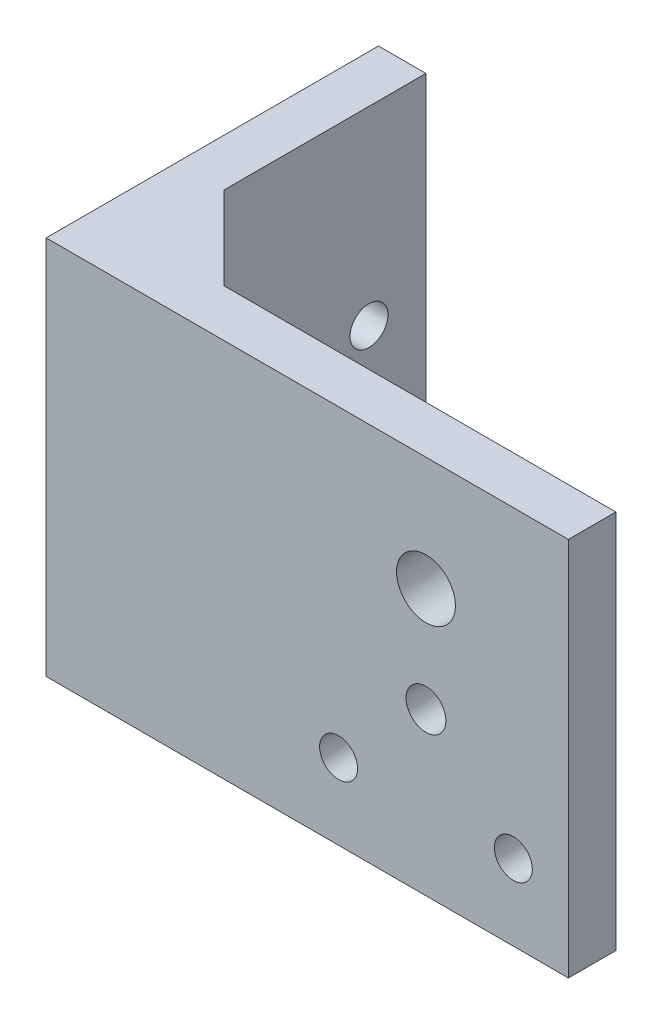
ISO-10303-21;
HEADER;
FILE_DESCRIPTION(('STEP AP214'),'2;1');
FILE_NAME('part.step','',(''),(''),'','','');
FILE_SCHEMA(('AUTOMOTIVE_DESIGN { 1 0 10303 214 1 1 1 1 }'));
ENDSEC;
DATA;
#1=APPLICATION_CONTEXT('core data for automotive mechanical design processes');
#2=APPLICATION_PROTOCOL_DEFINITION('international standard','automotive_design',2000,#1);
#3=PRODUCT_CONTEXT('',#1,'mechanical');
#4=PRODUCT('Part','Part','',(#3));
#5=PRODUCT_RELATED_PRODUCT_CATEGORY('part','',(#4));
#6=PRODUCT_DEFINITION_FORMATION('','',#4);
#7=PRODUCT_DEFINITION_CONTEXT('part definition',#1,'design');
#8=PRODUCT_DEFINITION('design','',#6,#7);
#9=PRODUCT_DEFINITION_SHAPE('','',#8);
#10=(LENGTH_UNIT() NAMED_UNIT(*) SI_UNIT(.MILLI.,.METRE.));
#11=(NAMED_UNIT(*) PLANE_ANGLE_UNIT() SI_UNIT($,.RADIAN.));
#12=(NAMED_UNIT(*) SI_UNIT($,.STERADIAN.) SOLID_ANGLE_UNIT());
#13=UNCERTAINTY_MEASURE_WITH_UNIT(LENGTH_MEASURE(1.E-05),#10,'distance_accuracy_value','');
#14=(GEOMETRIC_REPRESENTATION_CONTEXT(3) GLOBAL_UNCERTAINTY_ASSIGNED_CONTEXT((#13)) GLOBAL_UNIT_ASSIGNED_CONTEXT((#10,
#11,#12)) REPRESENTATION_CONTEXT('',''));
#15=CARTESIAN_POINT('',(0.,0.,0.));
#16=DIRECTION('',(0.,0.,1.));
#17=DIRECTION('',(1.,0.,0.));
#18=AXIS2_PLACEMENT_3D('',#15,#16,#17);
#19=CARTESIAN_POINT('',(5.,40.,-35.));
#20=DIRECTION('',(1.,0.,0.));
#21=DIRECTION('',(0.,0.,-1.));
#22=AXIS2_PLACEMENT_3D('',#19,#20,#21);
#23=PLANE('',#22);
#24=CARTESIAN_POINT('',(5.,31.,-11.));
#25=DIRECTION('',(1.,0.,0.));
#26=DIRECTION('',(0.,0.,-1.));
#27=AXIS2_PLACEMENT_3D('',#24,#25,#26);
#28=CIRCLE('',#27,2.);
#29=CARTESIAN_POINT('',(5.,31.,-13.));
#30=VERTEX_POINT('',#29);
#31=EDGE_CURVE('E481',#30,#30,#28,.T.);
#32=ORIENTED_EDGE('',*,*,#31,.F.);
#33=EDGE_LOOP('',(#32));
#34=FACE_BOUND('',#33,.T.);
#35=CARTESIAN_POINT('',(5.,20.,-29.));
#36=DIRECTION('',(1.,0.,0.));
#37=DIRECTION('',(0.,0.,-1.));
#38=AXIS2_PLACEMENT_3D('',#35,#36,#37);
#39=CIRCLE('',#38,2.);
#40=CARTESIAN_POINT('',(5.,20.,-31.));
#41=VERTEX_POINT('',#40);
#42=EDGE_CURVE('E477',#41,#41,#39,.T.);
#43=ORIENTED_EDGE('',*,*,#42,.F.);
#44=EDGE_LOOP('',(#43));
#45=FACE_BOUND('',#44,.T.);
#46=CARTESIAN_POINT('',(5.,8.99999999999999,-11.));
#47=DIRECTION('',(1.,0.,0.));
#48=DIRECTION('',(0.,0.,-1.));
#49=AXIS2_PLACEMENT_3D('',#46,#47,#48);
#50=CIRCLE('',#49,2.);
#51=CARTESIAN_POINT('',(5.,8.99999999999999,-13.));
#52=VERTEX_POINT('',#51);
#53=EDGE_CURVE('E469',#52,#52,#50,.T.);
#54=ORIENTED_EDGE('',*,*,#53,.F.);
#55=EDGE_LOOP('',(#54));
#56=FACE_BOUND('',#55,.T.);
#57=DIRECTION('',(0.,0.,1.));
#58=VECTOR('',#57,1.);
#59=CARTESIAN_POINT('',(5.,5.,-13.7500000000001));
#60=LINE('',#59,#58);
#61=CARTESIAN_POINT('',(5.,5.,-13.7500000000001));
#62=VERTEX_POINT('',#61);
#63=CARTESIAN_POINT('',(5.,5.,-5.));
#64=VERTEX_POINT('',#63);
#65=EDGE_CURVE('E195',#62,#64,#60,.T.);
#66=ORIENTED_EDGE('',*,*,#65,.F.);
#67=DIRECTION('',(0.,-1.,0.));
#68=VECTOR('',#67,1.);
#69=CARTESIAN_POINT('',(5.,5.,-13.7500000000001));
#70=LINE('',#69,#68);
#71=CARTESIAN_POINT('',(5.,0.,-13.7500000000001));
#72=VERTEX_POINT('',#71);
#73=EDGE_CURVE('E424',#62,#72,#70,.T.);
#74=ORIENTED_EDGE('',*,*,#73,.T.);
#75=DIRECTION('',(0.,0.,1.));
#76=VECTOR('',#75,1.);
#77=CARTESIAN_POINT('',(5.,0.,-35.));
#78=LINE('',#77,#76);
#79=CARTESIAN_POINT('',(5.,0.,-35.));
#80=VERTEX_POINT('',#79);
#81=EDGE_CURVE('E157',#80,#72,#78,.T.);
#82=ORIENTED_EDGE('',*,*,#81,.F.);
#83=DIRECTION('',(0.,-1.,0.));
#84=VECTOR('',#83,1.);
#85=CARTESIAN_POINT('',(5.,40.,-35.));
#86=LINE('',#85,#84);
#87=CARTESIAN_POINT('',(5.,40.,-35.));
#88=VERTEX_POINT('',#87);
#89=EDGE_CURVE('E49',#88,#80,#86,.T.);
#90=ORIENTED_EDGE('',*,*,#89,.F.);
#91=DIRECTION('',(0.,0.,1.));
#92=VECTOR('',#91,1.);
#93=CARTESIAN_POINT('',(5.,40.,-35.));
#94=LINE('',#93,#92);
#95=CARTESIAN_POINT('',(5.,40.,-13.7500000000001));
#96=VERTEX_POINT('',#95);
#97=EDGE_CURVE('E116',#88,#96,#94,.T.);
#98=ORIENTED_EDGE('',*,*,#97,.T.);
#99=DIRECTION('',(0.,-1.,0.));
#100=VECTOR('',#99,1.);
#101=CARTESIAN_POINT('',(5.,40.,-13.7500000000001));
#102=LINE('',#101,#100);
#103=CARTESIAN_POINT('',(5.,35.,-13.7500000000001));
#104=VERTEX_POINT('',#103);
#105=EDGE_CURVE('E11',#96,#104,#102,.T.);
#106=ORIENTED_EDGE('',*,*,#105,.T.);
#107=DIRECTION('',(0.,0.,1.));
#108=VECTOR('',#107,1.);
#109=CARTESIAN_POINT('',(5.,35.,-13.7500000000001));
#110=LINE('',#109,#108);
#111=CARTESIAN_POINT('',(5.,35.,-5.));
#112=VERTEX_POINT('',#111);
#113=EDGE_CURVE('E214',#104,#112,#110,.T.);
#114=ORIENTED_EDGE('',*,*,#113,.T.);
#115=DIRECTION('',(0.,-1.,0.));
#116=VECTOR('',#115,1.);
#117=CARTESIAN_POINT('',(5.,35.,-5.));
#118=LINE('',#117,#116);
#119=EDGE_CURVE('E145',#112,#64,#118,.T.);
#120=ORIENTED_EDGE('',*,*,#119,.T.);
#121=EDGE_LOOP('',(#66,#74,#82,#90,#98,#106,#114,#120));
#122=FACE_BOUND('',#121,.T.);
#123=ADVANCED_FACE('F39',(#34,#45,#56,#122),#23,.T.);
#124=CARTESIAN_POINT('',(13.75,40.,-5.));
#125=DIRECTION('',(0.,0.,-1.));
#126=DIRECTION('',(-1.,0.,0.));
#127=AXIS2_PLACEMENT_3D('',#124,#125,#126);
#128=PLANE('',#127);
#129=CARTESIAN_POINT('',(40.,28.,-5.));
#130=DIRECTION('',(0.,0.,-1.));
#131=DIRECTION('',(-1.,0.,0.));
#132=AXIS2_PLACEMENT_3D('',#129,#130,#131);
#133=CIRCLE('',#132,3.1);
#134=CARTESIAN_POINT('',(36.9,28.,-5.));
#135=VERTEX_POINT('',#134);
#136=EDGE_CURVE('E459',#135,#135,#133,.T.);
#137=ORIENTED_EDGE('',*,*,#136,.F.);
#138=EDGE_LOOP('',(#137));
#139=FACE_BOUND('',#138,.T.);
#140=CARTESIAN_POINT('',(49.2,8.,-5.));
#141=DIRECTION('',(0.,0.,-1.));
#142=DIRECTION('',(-1.,0.,0.));
#143=AXIS2_PLACEMENT_3D('',#140,#141,#142);
#144=CIRCLE('',#143,2.);
#145=CARTESIAN_POINT('',(47.2,8.,-5.));
#146=VERTEX_POINT('',#145);
#147=EDGE_CURVE('E455',#146,#146,#144,.T.);
#148=ORIENTED_EDGE('',*,*,#147,.F.);
#149=EDGE_LOOP('',(#148));
#150=FACE_BOUND('',#149,.T.);
#151=CARTESIAN_POINT('',(40.,17.,-5.));
#152=DIRECTION('',(0.,0.,-1.));
#153=DIRECTION('',(-1.,0.,0.));
#154=AXIS2_PLACEMENT_3D('',#151,#152,#153);
#155=CIRCLE('',#154,2.1);
#156=CARTESIAN_POINT('',(37.9,17.,-5.));
#157=VERTEX_POINT('',#156);
#158=EDGE_CURVE('E447',#157,#157,#155,.T.);
#159=ORIENTED_EDGE('',*,*,#158,.F.);
#160=EDGE_LOOP('',(#159));
#161=FACE_BOUND('',#160,.T.);
#162=CARTESIAN_POINT('',(30.8,8.,-5.));
#163=DIRECTION('',(0.,0.,-1.));
#164=DIRECTION('',(-1.,0.,0.));
#165=AXIS2_PLACEMENT_3D('',#162,#163,#164);
#166=CIRCLE('',#165,2.);
#167=CARTESIAN_POINT('',(28.8,8.,-5.));
#168=VERTEX_POINT('',#167);
#169=EDGE_CURVE('E438',#168,#168,#166,.T.);
#170=ORIENTED_EDGE('',*,*,#169,.F.);
#171=EDGE_LOOP('',(#170));
#172=FACE_BOUND('',#171,.T.);
#173=DIRECTION('',(1.,0.,0.));
#174=VECTOR('',#173,1.);
#175=CARTESIAN_POINT('',(13.75,0.,-5.));
#176=LINE('',#175,#174);
#177=CARTESIAN_POINT('',(13.75,0.,-5.));
#178=VERTEX_POINT('',#177);
#179=CARTESIAN_POINT('',(55.,0.,-5.));
#180=VERTEX_POINT('',#179);
#181=EDGE_CURVE('E141',#178,#180,#176,.T.);
#182=ORIENTED_EDGE('',*,*,#181,.F.);
#183=DIRECTION('',(0.,-1.,0.));
#184=VECTOR('',#183,1.);
#185=CARTESIAN_POINT('',(13.75,5.,-5.));
#186=LINE('',#185,#184);
#187=CARTESIAN_POINT('',(13.75,5.,-5.));
#188=VERTEX_POINT('',#187);
#189=EDGE_CURVE('E210',#188,#178,#186,.T.);
#190=ORIENTED_EDGE('',*,*,#189,.F.);
#191=DIRECTION('',(1.,0.,0.));
#192=VECTOR('',#191,1.);
#193=CARTESIAN_POINT('',(5.,5.,-5.));
#194=LINE('',#193,#192);
#195=EDGE_CURVE('E198',#64,#188,#194,.T.);
#196=ORIENTED_EDGE('',*,*,#195,.F.);
#197=ORIENTED_EDGE('',*,*,#119,.F.);
#198=DIRECTION('',(1.,0.,0.));
#199=VECTOR('',#198,1.);
#200=CARTESIAN_POINT('',(5.,35.,-5.));
#201=LINE('',#200,#199);
#202=CARTESIAN_POINT('',(13.75,35.,-5.));
#203=VERTEX_POINT('',#202);
#204=EDGE_CURVE('E419',#112,#203,#201,.T.);
#205=ORIENTED_EDGE('',*,*,#204,.T.);
#206=DIRECTION('',(0.,-1.,0.));
#207=VECTOR('',#206,1.);
#208=CARTESIAN_POINT('',(13.75,40.,-5.));
#209=LINE('',#208,#207);
#210=CARTESIAN_POINT('',(13.75,40.,-5.));
#211=VERTEX_POINT('',#210);
#212=EDGE_CURVE('E43',#211,#203,#209,.T.);
#213=ORIENTED_EDGE('',*,*,#212,.F.);
#214=DIRECTION('',(1.,0.,0.));
#215=VECTOR('',#214,1.);
#216=CARTESIAN_POINT('',(13.75,40.,-5.));
#217=LINE('',#216,#215);
#218=CARTESIAN_POINT('',(55.,40.,-5.));
#219=VERTEX_POINT('',#218);
#220=EDGE_CURVE('E223',#211,#219,#217,.T.);
#221=ORIENTED_EDGE('',*,*,#220,.T.);
#222=DIRECTION('',(0.,-1.,0.));
#223=VECTOR('',#222,1.);
#224=CARTESIAN_POINT('',(55.,40.,-5.));
#225=LINE('',#224,#223);
#226=EDGE_CURVE('E168',#219,#180,#225,.T.);
#227=ORIENTED_EDGE('',*,*,#226,.T.);
#228=EDGE_LOOP('',(#182,#190,#196,#197,#205,#213,#221,#227));
#229=FACE_BOUND('',#228,.T.);
#230=ADVANCED_FACE('F209',(#139,#150,#161,#172,#229),#128,.T.);
#231=CARTESIAN_POINT('',(5.,40.,-13.7500000000001));
#232=DIRECTION('',(0.707106781186553,0.,-0.707106781186542));
#233=DIRECTION('',(-0.707106781186542,0.,-0.707106781186553));
#234=AXIS2_PLACEMENT_3D('',#231,#232,#233);
#235=PLANE('',#234);
#236=ORIENTED_EDGE('',*,*,#212,.T.);
#237=DIRECTION('',(-0.707106781186542,0.,-0.707106781186553));
#238=VECTOR('',#237,1.);
#239=CARTESIAN_POINT('',(13.75,35.,-5.));
#240=LINE('',#239,#238);
#241=EDGE_CURVE('E177',#203,#104,#240,.T.);
#242=ORIENTED_EDGE('',*,*,#241,.T.);
#243=ORIENTED_EDGE('',*,*,#105,.F.);
#244=DIRECTION('',(0.707106781186542,0.,0.707106781186553));
#245=VECTOR('',#244,1.);
#246=CARTESIAN_POINT('',(5.,40.,-13.7500000000001));
#247=LINE('',#246,#245);
#248=EDGE_CURVE('E159',#96,#211,#247,.T.);
#249=ORIENTED_EDGE('',*,*,#248,.T.);
#250=EDGE_LOOP('',(#236,#242,#243,#249));
#251=FACE_BOUND('',#250,.T.);
#252=ADVANCED_FACE('F41',(#251),#235,.T.);
#253=CARTESIAN_POINT('',(0.,0.,0.));
#254=DIRECTION('',(0.,1.,0.));
#255=DIRECTION('',(0.,0.,1.));
#256=AXIS2_PLACEMENT_3D('',#253,#254,#255);
#257=PLANE('',#256);
#258=ORIENTED_EDGE('',*,*,#81,.T.);
#259=DIRECTION('',(-0.707106781186542,0.,-0.707106781186553));
#260=VECTOR('',#259,1.);
#261=CARTESIAN_POINT('',(13.75,0.,-5.));
#262=LINE('',#261,#260);
#263=EDGE_CURVE('E57',#178,#72,#262,.T.);
#264=ORIENTED_EDGE('',*,*,#263,.F.);
#265=ORIENTED_EDGE('',*,*,#181,.T.);
#266=DIRECTION('',(0.,0.,-1.));
#267=VECTOR('',#266,1.);
#268=CARTESIAN_POINT('',(55.,0.,0.));
#269=LINE('',#268,#267);
#270=CARTESIAN_POINT('',(55.,0.,0.));
#271=VERTEX_POINT('',#270);
#272=EDGE_CURVE('E144',#271,#180,#269,.T.);
#273=ORIENTED_EDGE('',*,*,#272,.F.);
#274=DIRECTION('',(1.,0.,0.));
#275=VECTOR('',#274,1.);
#276=CARTESIAN_POINT('',(0.,0.,0.));
#277=LINE('',#276,#275);
#278=CARTESIAN_POINT('',(0.,0.,0.));
#279=VERTEX_POINT('',#278);
#280=EDGE_CURVE('E149',#279,#271,#277,.T.);
#281=ORIENTED_EDGE('',*,*,#280,.F.);
#282=DIRECTION('',(0.,0.,1.));
#283=VECTOR('',#282,1.);
#284=CARTESIAN_POINT('',(0.,0.,-35.));
#285=LINE('',#284,#283);
#286=CARTESIAN_POINT('',(0.,0.,-35.));
#287=VERTEX_POINT('',#286);
#288=EDGE_CURVE('E152',#287,#279,#285,.T.);
#289=ORIENTED_EDGE('',*,*,#288,.F.);
#290=DIRECTION('',(-1.,0.,0.));
#291=VECTOR('',#290,1.);
#292=CARTESIAN_POINT('',(5.,0.,-35.));
#293=LINE('',#292,#291);
#294=EDGE_CURVE('E122',#80,#287,#293,.T.);
#295=ORIENTED_EDGE('',*,*,#294,.F.);
#296=EDGE_LOOP('',(#258,#264,#265,#273,#281,#289,#295));
#297=FACE_BOUND('',#296,.T.);
#298=ADVANCED_FACE('F232',(#297),#257,.F.);
#299=CARTESIAN_POINT('',(5.,40.,-35.));
#300=DIRECTION('',(0.,0.,1.));
#301=DIRECTION('',(1.,0.,0.));
#302=AXIS2_PLACEMENT_3D('',#299,#300,#301);
#303=PLANE('',#302);
#304=ORIENTED_EDGE('',*,*,#294,.T.);
#305=DIRECTION('',(0.,-1.,0.));
#306=VECTOR('',#305,1.);
#307=CARTESIAN_POINT('',(0.,40.,-35.));
#308=LINE('',#307,#306);
#309=CARTESIAN_POINT('',(0.,40.,-35.));
#310=VERTEX_POINT('',#309);
#311=EDGE_CURVE('E120',#310,#287,#308,.T.);
#312=ORIENTED_EDGE('',*,*,#311,.F.);
#313=DIRECTION('',(-1.,0.,0.));
#314=VECTOR('',#313,1.);
#315=CARTESIAN_POINT('',(5.,40.,-35.));
#316=LINE('',#315,#314);
#317=EDGE_CURVE('E109',#88,#310,#316,.T.);
#318=ORIENTED_EDGE('',*,*,#317,.F.);
#319=ORIENTED_EDGE('',*,*,#89,.T.);
#320=EDGE_LOOP('',(#304,#312,#318,#319));
#321=FACE_BOUND('',#320,.T.);
#322=ADVANCED_FACE('F121',(#321),#303,.F.);
#323=CARTESIAN_POINT('',(0.,40.,-35.));
#324=DIRECTION('',(1.,0.,0.));
#325=DIRECTION('',(0.,0.,-1.));
#326=AXIS2_PLACEMENT_3D('',#323,#324,#325);
#327=PLANE('',#326);
#328=CARTESIAN_POINT('',(0.,31.,-11.));
#329=DIRECTION('',(1.,0.,0.));
#330=DIRECTION('',(0.,0.,-1.));
#331=AXIS2_PLACEMENT_3D('',#328,#329,#330);
#332=CIRCLE('',#331,2.);
#333=CARTESIAN_POINT('',(0.,31.,-13.));
#334=VERTEX_POINT('',#333);
#335=EDGE_CURVE('E439',#334,#334,#332,.T.);
#336=ORIENTED_EDGE('',*,*,#335,.T.);
#337=EDGE_LOOP('',(#336));
#338=FACE_BOUND('',#337,.T.);
#339=CARTESIAN_POINT('',(0.,20.,-29.));
#340=DIRECTION('',(1.,0.,0.));
#341=DIRECTION('',(0.,0.,-1.));
#342=AXIS2_PLACEMENT_3D('',#339,#340,#341);
#343=CIRCLE('',#342,2.);
#344=CARTESIAN_POINT('',(0.,20.,-31.));
#345=VERTEX_POINT('',#344);
#346=EDGE_CURVE('E473',#345,#345,#343,.T.);
#347=ORIENTED_EDGE('',*,*,#346,.T.);
#348=EDGE_LOOP('',(#347));
#349=FACE_BOUND('',#348,.T.);
#350=CARTESIAN_POINT('',(0.,8.99999999999999,-11.));
#351=DIRECTION('',(1.,0.,0.));
#352=DIRECTION('',(0.,0.,-1.));
#353=AXIS2_PLACEMENT_3D('',#350,#351,#352);
#354=CIRCLE('',#353,2.);
#355=CARTESIAN_POINT('',(0.,8.99999999999999,-13.));
#356=VERTEX_POINT('',#355);
#357=EDGE_CURVE('E465',#356,#356,#354,.T.);
#358=ORIENTED_EDGE('',*,*,#357,.T.);
#359=EDGE_LOOP('',(#358));
#360=FACE_BOUND('',#359,.T.);
#361=ORIENTED_EDGE('',*,*,#288,.T.);
#362=DIRECTION('',(0.,-1.,0.));
#363=VECTOR('',#362,1.);
#364=CARTESIAN_POINT('',(0.,40.,0.));
#365=LINE('',#364,#363);
#366=CARTESIAN_POINT('',(0.,40.,0.));
#367=VERTEX_POINT('',#366);
#368=EDGE_CURVE('E126',#367,#279,#365,.T.);
#369=ORIENTED_EDGE('',*,*,#368,.F.);
#370=DIRECTION('',(0.,0.,1.));
#371=VECTOR('',#370,1.);
#372=CARTESIAN_POINT('',(0.,40.,-35.));
#373=LINE('',#372,#371);
#374=EDGE_CURVE('E113',#310,#367,#373,.T.);
#375=ORIENTED_EDGE('',*,*,#374,.F.);
#376=ORIENTED_EDGE('',*,*,#311,.T.);
#377=EDGE_LOOP('',(#361,#369,#375,#376));
#378=FACE_BOUND('',#377,.T.);
#379=ADVANCED_FACE('F128',(#338,#349,#360,#378),#327,.F.);
#380=CARTESIAN_POINT('',(0.,40.,0.));
#381=DIRECTION('',(0.,0.,-1.));
#382=DIRECTION('',(-1.,0.,0.));
#383=AXIS2_PLACEMENT_3D('',#380,#381,#382);
#384=PLANE('',#383);
#385=CARTESIAN_POINT('',(40.,28.,0.));
#386=DIRECTION('',(0.,0.,-1.));
#387=DIRECTION('',(-1.,0.,0.));
#388=AXIS2_PLACEMENT_3D('',#385,#386,#387);
#389=CIRCLE('',#388,3.1);
#390=CARTESIAN_POINT('',(36.9,28.,0.));
#391=VERTEX_POINT('',#390);
#392=EDGE_CURVE('E431',#391,#391,#389,.T.);
#393=ORIENTED_EDGE('',*,*,#392,.T.);
#394=EDGE_LOOP('',(#393));
#395=FACE_BOUND('',#394,.T.);
#396=CARTESIAN_POINT('',(49.2,8.,0.));
#397=DIRECTION('',(0.,0.,-1.));
#398=DIRECTION('',(-1.,0.,0.));
#399=AXIS2_PLACEMENT_3D('',#396,#397,#398);
#400=CIRCLE('',#399,2.);
#401=CARTESIAN_POINT('',(47.2,8.,0.));
#402=VERTEX_POINT('',#401);
#403=EDGE_CURVE('E451',#402,#402,#400,.T.);
#404=ORIENTED_EDGE('',*,*,#403,.T.);
#405=EDGE_LOOP('',(#404));
#406=FACE_BOUND('',#405,.T.);
#407=CARTESIAN_POINT('',(40.,17.,0.));
#408=DIRECTION('',(0.,0.,-1.));
#409=DIRECTION('',(-1.,0.,0.));
#410=AXIS2_PLACEMENT_3D('',#407,#408,#409);
#411=CIRCLE('',#410,2.1);
#412=CARTESIAN_POINT('',(37.9,17.,0.));
#413=VERTEX_POINT('',#412);
#414=EDGE_CURVE('E443',#413,#413,#411,.T.);
#415=ORIENTED_EDGE('',*,*,#414,.T.);
#416=EDGE_LOOP('',(#415));
#417=FACE_BOUND('',#416,.T.);
#418=CARTESIAN_POINT('',(30.8,8.,0.));
#419=DIRECTION('',(0.,0.,-1.));
#420=DIRECTION('',(-1.,0.,0.));
#421=AXIS2_PLACEMENT_3D('',#418,#419,#420);
#422=CIRCLE('',#421,2.);
#423=CARTESIAN_POINT('',(28.8,8.,0.));
#424=VERTEX_POINT('',#423);
#425=EDGE_CURVE('E434',#424,#424,#422,.T.);
#426=ORIENTED_EDGE('',*,*,#425,.T.);
#427=EDGE_LOOP('',(#426));
#428=FACE_BOUND('',#427,.T.);
#429=ORIENTED_EDGE('',*,*,#280,.T.);
#430=DIRECTION('',(0.,-1.,0.));
#431=VECTOR('',#430,1.);
#432=CARTESIAN_POINT('',(55.,40.,0.));
#433=LINE('',#432,#431);
#434=CARTESIAN_POINT('',(55.,40.,0.));
#435=VERTEX_POINT('',#434);
#436=EDGE_CURVE('E165',#435,#271,#433,.T.);
#437=ORIENTED_EDGE('',*,*,#436,.F.);
#438=DIRECTION('',(1.,0.,0.));
#439=VECTOR('',#438,1.);
#440=CARTESIAN_POINT('',(0.,40.,0.));
#441=LINE('',#440,#439);
#442=EDGE_CURVE('E132',#367,#435,#441,.T.);
#443=ORIENTED_EDGE('',*,*,#442,.F.);
#444=ORIENTED_EDGE('',*,*,#368,.T.);
#445=EDGE_LOOP('',(#429,#437,#443,#444));
#446=FACE_BOUND('',#445,.T.);
#447=ADVANCED_FACE('F234',(#395,#406,#417,#428,#446),#384,.F.);
#448=CARTESIAN_POINT('',(55.,40.,0.));
#449=DIRECTION('',(-1.,0.,0.));
#450=DIRECTION('',(0.,0.,1.));
#451=AXIS2_PLACEMENT_3D('',#448,#449,#450);
#452=PLANE('',#451);
#453=ORIENTED_EDGE('',*,*,#272,.T.);
#454=ORIENTED_EDGE('',*,*,#226,.F.);
#455=DIRECTION('',(0.,0.,-1.));
#456=VECTOR('',#455,1.);
#457=CARTESIAN_POINT('',(55.,40.,0.));
#458=LINE('',#457,#456);
#459=EDGE_CURVE('E135',#435,#219,#458,.T.);
#460=ORIENTED_EDGE('',*,*,#459,.F.);
#461=ORIENTED_EDGE('',*,*,#436,.T.);
#462=EDGE_LOOP('',(#453,#454,#460,#461));
#463=FACE_BOUND('',#462,.T.);
#464=ADVANCED_FACE('F229',(#463),#452,.F.);
#465=CARTESIAN_POINT('',(0.,40.,0.));
#466=DIRECTION('',(0.,1.,0.));
#467=DIRECTION('',(0.,0.,1.));
#468=AXIS2_PLACEMENT_3D('',#465,#466,#467);
#469=PLANE('',#468);
#470=ORIENTED_EDGE('',*,*,#248,.F.);
#471=ORIENTED_EDGE('',*,*,#97,.F.);
#472=ORIENTED_EDGE('',*,*,#317,.T.);
#473=ORIENTED_EDGE('',*,*,#374,.T.);
#474=ORIENTED_EDGE('',*,*,#442,.T.);
#475=ORIENTED_EDGE('',*,*,#459,.T.);
#476=ORIENTED_EDGE('',*,*,#220,.F.);
#477=EDGE_LOOP('',(#470,#471,#472,#473,#474,#475,#476));
#478=FACE_BOUND('',#477,.T.);
#479=ADVANCED_FACE('F111',(#478),#469,.T.);
#480=CARTESIAN_POINT('',(0.,35.,0.));
#481=DIRECTION('',(0.,-1.,0.));
#482=DIRECTION('',(0.,0.,-1.));
#483=AXIS2_PLACEMENT_3D('',#480,#481,#482);
#484=PLANE('',#483);
#485=ORIENTED_EDGE('',*,*,#204,.F.);
#486=ORIENTED_EDGE('',*,*,#113,.F.);
#487=ORIENTED_EDGE('',*,*,#241,.F.);
#488=EDGE_LOOP('',(#485,#486,#487));
#489=FACE_BOUND('',#488,.T.);
#490=ADVANCED_FACE('F379',(#489),#484,.T.);
#491=CARTESIAN_POINT('',(13.75,5.,-5.));
#492=DIRECTION('',(-0.707106781186553,0.,0.707106781186542));
#493=DIRECTION('',(0.707106781186542,0.,0.707106781186553));
#494=AXIS2_PLACEMENT_3D('',#491,#492,#493);
#495=PLANE('',#494);
#496=ORIENTED_EDGE('',*,*,#263,.T.);
#497=ORIENTED_EDGE('',*,*,#73,.F.);
#498=DIRECTION('',(-0.707106781186542,0.,-0.707106781186553));
#499=VECTOR('',#498,1.);
#500=CARTESIAN_POINT('',(13.75,5.,-5.));
#501=LINE('',#500,#499);
#502=EDGE_CURVE('E200',#188,#62,#501,.T.);
#503=ORIENTED_EDGE('',*,*,#502,.F.);
#504=ORIENTED_EDGE('',*,*,#189,.T.);
#505=EDGE_LOOP('',(#496,#497,#503,#504));
#506=FACE_BOUND('',#505,.T.);
#507=ADVANCED_FACE('F376',(#506),#495,.F.);
#508=CARTESIAN_POINT('',(0.,5.,0.));
#509=DIRECTION('',(0.,1.,0.));
#510=DIRECTION('',(0.,0.,1.));
#511=AXIS2_PLACEMENT_3D('',#508,#509,#510);
#512=PLANE('',#511);
#513=ORIENTED_EDGE('',*,*,#65,.T.);
#514=ORIENTED_EDGE('',*,*,#195,.T.);
#515=ORIENTED_EDGE('',*,*,#502,.T.);
#516=EDGE_LOOP('',(#513,#514,#515));
#517=FACE_BOUND('',#516,.T.);
#518=ADVANCED_FACE('F197',(#517),#512,.T.);
#519=CARTESIAN_POINT('',(30.8,8.,0.));
#520=DIRECTION('',(0.,0.,-1.));
#521=DIRECTION('',(-1.,0.,0.));
#522=AXIS2_PLACEMENT_3D('',#519,#520,#521);
#523=CYLINDRICAL_SURFACE('',#522,2.);
#524=ORIENTED_EDGE('',*,*,#425,.F.);
#525=EDGE_LOOP('',(#524));
#526=FACE_BOUND('',#525,.T.);
#527=ORIENTED_EDGE('',*,*,#169,.T.);
#528=EDGE_LOOP('',(#527));
#529=FACE_BOUND('',#528,.T.);
#530=ADVANCED_FACE('F292',(#526,#529),#523,.F.);
#531=CARTESIAN_POINT('',(40.,17.,0.));
#532=DIRECTION('',(0.,0.,-1.));
#533=DIRECTION('',(-1.,0.,0.));
#534=AXIS2_PLACEMENT_3D('',#531,#532,#533);
#535=CYLINDRICAL_SURFACE('',#534,2.1);
#536=ORIENTED_EDGE('',*,*,#414,.F.);
#537=EDGE_LOOP('',(#536));
#538=FACE_BOUND('',#537,.T.);
#539=ORIENTED_EDGE('',*,*,#158,.T.);
#540=EDGE_LOOP('',(#539));
#541=FACE_BOUND('',#540,.T.);
#542=ADVANCED_FACE('F297',(#538,#541),#535,.F.);
#543=CARTESIAN_POINT('',(49.2,8.,0.));
#544=DIRECTION('',(0.,0.,-1.));
#545=DIRECTION('',(-1.,0.,0.));
#546=AXIS2_PLACEMENT_3D('',#543,#544,#545);
#547=CYLINDRICAL_SURFACE('',#546,2.);
#548=ORIENTED_EDGE('',*,*,#403,.F.);
#549=EDGE_LOOP('',(#548));
#550=FACE_BOUND('',#549,.T.);
#551=ORIENTED_EDGE('',*,*,#147,.T.);
#552=EDGE_LOOP('',(#551));
#553=FACE_BOUND('',#552,.T.);
#554=ADVANCED_FACE('F307',(#550,#553),#547,.F.);
#555=CARTESIAN_POINT('',(40.,28.,0.));
#556=DIRECTION('',(0.,0.,-1.));
#557=DIRECTION('',(-1.,0.,0.));
#558=AXIS2_PLACEMENT_3D('',#555,#556,#557);
#559=CYLINDRICAL_SURFACE('',#558,3.1);
#560=ORIENTED_EDGE('',*,*,#392,.F.);
#561=EDGE_LOOP('',(#560));
#562=FACE_BOUND('',#561,.T.);
#563=ORIENTED_EDGE('',*,*,#136,.T.);
#564=EDGE_LOOP('',(#563));
#565=FACE_BOUND('',#564,.T.);
#566=ADVANCED_FACE('F317',(#562,#565),#559,.F.);
#567=CARTESIAN_POINT('',(0.,8.99999999999999,-11.));
#568=DIRECTION('',(1.,0.,0.));
#569=DIRECTION('',(0.,0.,-1.));
#570=AXIS2_PLACEMENT_3D('',#567,#568,#569);
#571=CYLINDRICAL_SURFACE('',#570,2.);
#572=ORIENTED_EDGE('',*,*,#357,.F.);
#573=EDGE_LOOP('',(#572));
#574=FACE_BOUND('',#573,.T.);
#575=ORIENTED_EDGE('',*,*,#53,.T.);
#576=EDGE_LOOP('',(#575));
#577=FACE_BOUND('',#576,.T.);
#578=ADVANCED_FACE('F326',(#574,#577),#571,.F.);
#579=CARTESIAN_POINT('',(0.,20.,-29.));
#580=DIRECTION('',(1.,0.,0.));
#581=DIRECTION('',(0.,0.,-1.));
#582=AXIS2_PLACEMENT_3D('',#579,#580,#581);
#583=CYLINDRICAL_SURFACE('',#582,2.);
#584=ORIENTED_EDGE('',*,*,#346,.F.);
#585=EDGE_LOOP('',(#584));
#586=FACE_BOUND('',#585,.T.);
#587=ORIENTED_EDGE('',*,*,#42,.T.);
#588=EDGE_LOOP('',(#587));
#589=FACE_BOUND('',#588,.T.);
#590=ADVANCED_FACE('F348',(#586,#589),#583,.F.);
#591=CARTESIAN_POINT('',(0.,31.,-11.));
#592=DIRECTION('',(1.,0.,0.));
#593=DIRECTION('',(0.,0.,-1.));
#594=AXIS2_PLACEMENT_3D('',#591,#592,#593);
#595=CYLINDRICAL_SURFACE('',#594,2.);
#596=ORIENTED_EDGE('',*,*,#335,.F.);
#597=EDGE_LOOP('',(#596));
#598=FACE_BOUND('',#597,.T.);
#599=ORIENTED_EDGE('',*,*,#31,.T.);
#600=EDGE_LOOP('',(#599));
#601=FACE_BOUND('',#600,.T.);
#602=ADVANCED_FACE('F358',(#598,#601),#595,.F.);
#603=CLOSED_SHELL('',(#123,#230,#252,#298,#322,#379,#447,#464,#479,#490,#507,#518,#530,#542,
#554,#566,#578,#590,#602));
#604=MANIFOLD_SOLID_BREP('B2',#603);
#605=ADVANCED_BREP_SHAPE_REPRESENTATION('',(#18,#604),#14);
#606=SHAPE_DEFINITION_REPRESENTATION(#9,#605);
ENDSEC;
END-ISO-10303-21;
